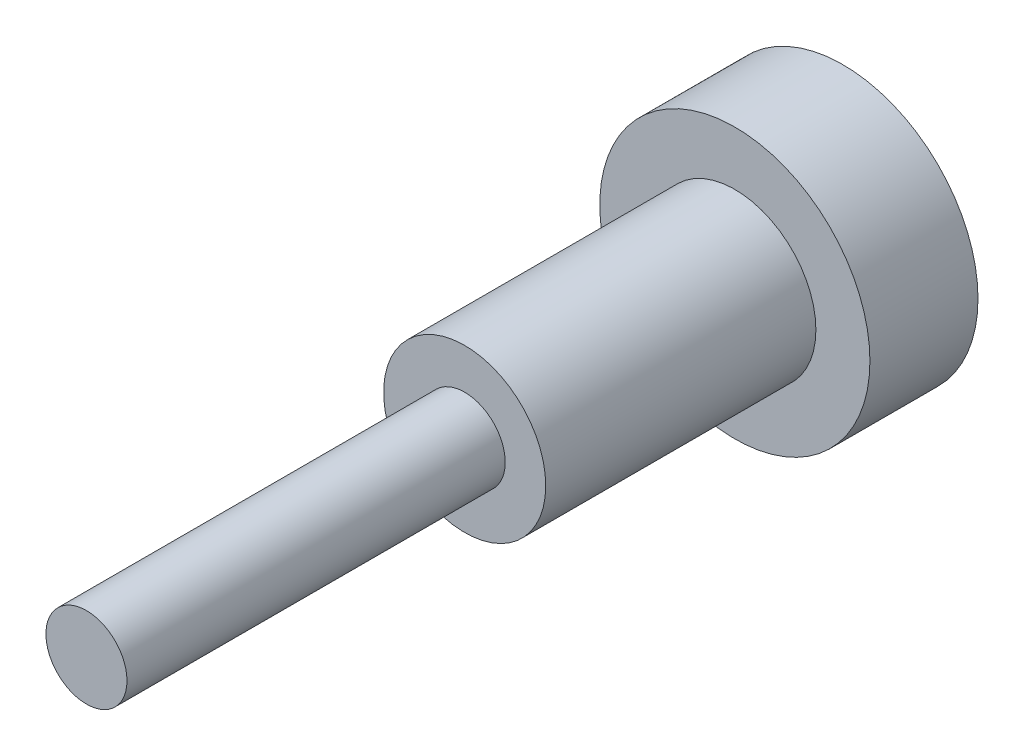
ISO-10303-21;
HEADER;
FILE_DESCRIPTION(('STEP AP214'),'2;1');
FILE_NAME('part.step','',(''),(''),'','','');
FILE_SCHEMA(('AUTOMOTIVE_DESIGN { 1 0 10303 214 1 1 1 1 }'));
ENDSEC;
DATA;
#1=APPLICATION_CONTEXT('core data for automotive mechanical design processes');
#2=APPLICATION_PROTOCOL_DEFINITION('international standard','automotive_design',2000,#1);
#3=PRODUCT_CONTEXT('',#1,'mechanical');
#4=PRODUCT('Part','Part','',(#3));
#5=PRODUCT_RELATED_PRODUCT_CATEGORY('part','',(#4));
#6=PRODUCT_DEFINITION_FORMATION('','',#4);
#7=PRODUCT_DEFINITION_CONTEXT('part definition',#1,'design');
#8=PRODUCT_DEFINITION('design','',#6,#7);
#9=PRODUCT_DEFINITION_SHAPE('','',#8);
#10=(LENGTH_UNIT() NAMED_UNIT(*) SI_UNIT(.MILLI.,.METRE.));
#11=(NAMED_UNIT(*) PLANE_ANGLE_UNIT() SI_UNIT($,.RADIAN.));
#12=(NAMED_UNIT(*) SI_UNIT($,.STERADIAN.) SOLID_ANGLE_UNIT());
#13=UNCERTAINTY_MEASURE_WITH_UNIT(LENGTH_MEASURE(1.E-05),#10,'distance_accuracy_value','');
#14=(GEOMETRIC_REPRESENTATION_CONTEXT(3) GLOBAL_UNCERTAINTY_ASSIGNED_CONTEXT((#13)) GLOBAL_UNIT_ASSIGNED_CONTEXT((#10,
#11,#12)) REPRESENTATION_CONTEXT('',''));
#15=CARTESIAN_POINT('',(0.,0.,0.));
#16=DIRECTION('',(0.,0.,1.));
#17=DIRECTION('',(1.,0.,0.));
#18=AXIS2_PLACEMENT_3D('',#15,#16,#17);
#19=CARTESIAN_POINT('',(0.,0.,12.));
#20=DIRECTION('',(0.,0.,-1.));
#21=DIRECTION('',(-1.,0.,0.));
#22=AXIS2_PLACEMENT_3D('',#19,#20,#21);
#23=CYLINDRICAL_SURFACE('',#22,0.75);
#24=CARTESIAN_POINT('',(0.,0.,5.));
#25=DIRECTION('',(0.,0.,1.));
#26=DIRECTION('',(1.,0.,0.));
#27=AXIS2_PLACEMENT_3D('',#24,#25,#26);
#28=CIRCLE('',#27,0.75);
#29=CARTESIAN_POINT('',(0.75,0.,5.));
#30=VERTEX_POINT('',#29);
#31=EDGE_CURVE('E43',#30,#30,#28,.T.);
#32=ORIENTED_EDGE('',*,*,#31,.T.);
#33=EDGE_LOOP('',(#32));
#34=FACE_BOUND('',#33,.T.);
#35=CARTESIAN_POINT('',(0.,0.,12.));
#36=DIRECTION('',(0.,0.,1.));
#37=DIRECTION('',(1.,0.,0.));
#38=AXIS2_PLACEMENT_3D('',#35,#36,#37);
#39=CIRCLE('',#38,0.75);
#40=CARTESIAN_POINT('',(0.75,0.,12.));
#41=VERTEX_POINT('',#40);
#42=EDGE_CURVE('E10',#41,#41,#39,.T.);
#43=ORIENTED_EDGE('',*,*,#42,.F.);
#44=EDGE_LOOP('',(#43));
#45=FACE_BOUND('',#44,.T.);
#46=ADVANCED_FACE('F33',(#34,#45),#23,.T.);
#47=CARTESIAN_POINT('',(0.,0.,12.));
#48=DIRECTION('',(0.,0.,1.));
#49=DIRECTION('',(1.,0.,0.));
#50=AXIS2_PLACEMENT_3D('',#47,#48,#49);
#51=PLANE('',#50);
#52=ORIENTED_EDGE('',*,*,#42,.T.);
#53=EDGE_LOOP('',(#52));
#54=FACE_BOUND('',#53,.T.);
#55=ADVANCED_FACE('F75',(#54),#51,.T.);
#56=CARTESIAN_POINT('',(0.,0.,5.));
#57=DIRECTION('',(0.,0.,-1.));
#58=DIRECTION('',(-1.,0.,0.));
#59=AXIS2_PLACEMENT_3D('',#56,#57,#58);
#60=CYLINDRICAL_SURFACE('',#59,1.5);
#61=CARTESIAN_POINT('',(0.,0.,5.));
#62=DIRECTION('',(0.,0.,1.));
#63=DIRECTION('',(1.,0.,0.));
#64=AXIS2_PLACEMENT_3D('',#61,#62,#63);
#65=CIRCLE('',#64,1.5);
#66=CARTESIAN_POINT('',(1.5,0.,5.));
#67=VERTEX_POINT('',#66);
#68=EDGE_CURVE('E39',#67,#67,#65,.T.);
#69=ORIENTED_EDGE('',*,*,#68,.F.);
#70=EDGE_LOOP('',(#69));
#71=FACE_BOUND('',#70,.T.);
#72=CARTESIAN_POINT('',(0.,0.,0.));
#73=DIRECTION('',(0.,0.,1.));
#74=DIRECTION('',(1.,0.,0.));
#75=AXIS2_PLACEMENT_3D('',#72,#73,#74);
#76=CIRCLE('',#75,1.5);
#77=CARTESIAN_POINT('',(1.5,0.,0.));
#78=VERTEX_POINT('',#77);
#79=EDGE_CURVE('E47',#78,#78,#76,.T.);
#80=ORIENTED_EDGE('',*,*,#79,.T.);
#81=EDGE_LOOP('',(#80));
#82=FACE_BOUND('',#81,.T.);
#83=ADVANCED_FACE('F80',(#71,#82),#60,.T.);
#84=CARTESIAN_POINT('',(0.,0.,5.));
#85=DIRECTION('',(0.,0.,1.));
#86=DIRECTION('',(1.,0.,0.));
#87=AXIS2_PLACEMENT_3D('',#84,#85,#86);
#88=PLANE('',#87);
#89=ORIENTED_EDGE('',*,*,#31,.F.);
#90=EDGE_LOOP('',(#89));
#91=FACE_BOUND('',#90,.T.);
#92=ORIENTED_EDGE('',*,*,#68,.T.);
#93=EDGE_LOOP('',(#92));
#94=FACE_BOUND('',#93,.T.);
#95=ADVANCED_FACE('F72',(#91,#94),#88,.T.);
#96=CARTESIAN_POINT('',(0.,0.,-2.));
#97=DIRECTION('',(0.,0.,1.));
#98=DIRECTION('',(1.,0.,0.));
#99=AXIS2_PLACEMENT_3D('',#96,#97,#98);
#100=CYLINDRICAL_SURFACE('',#99,2.5);
#101=CARTESIAN_POINT('',(0.,0.,-2.));
#102=DIRECTION('',(0.,0.,1.));
#103=DIRECTION('',(1.,0.,0.));
#104=AXIS2_PLACEMENT_3D('',#101,#102,#103);
#105=CIRCLE('',#104,2.5);
#106=CARTESIAN_POINT('',(2.5,0.,-2.));
#107=VERTEX_POINT('',#106);
#108=EDGE_CURVE('E52',#107,#107,#105,.T.);
#109=ORIENTED_EDGE('',*,*,#108,.T.);
#110=EDGE_LOOP('',(#109));
#111=FACE_BOUND('',#110,.T.);
#112=CARTESIAN_POINT('',(0.,0.,0.));
#113=DIRECTION('',(0.,0.,1.));
#114=DIRECTION('',(1.,0.,0.));
#115=AXIS2_PLACEMENT_3D('',#112,#113,#114);
#116=CIRCLE('',#115,2.5);
#117=CARTESIAN_POINT('',(2.5,0.,0.));
#118=VERTEX_POINT('',#117);
#119=EDGE_CURVE('E53',#118,#118,#116,.T.);
#120=ORIENTED_EDGE('',*,*,#119,.F.);
#121=EDGE_LOOP('',(#120));
#122=FACE_BOUND('',#121,.T.);
#123=ADVANCED_FACE('F59',(#111,#122),#100,.T.);
#124=CARTESIAN_POINT('',(0.,0.,-2.));
#125=DIRECTION('',(0.,0.,1.));
#126=DIRECTION('',(1.,0.,0.));
#127=AXIS2_PLACEMENT_3D('',#124,#125,#126);
#128=PLANE('',#127);
#129=ORIENTED_EDGE('',*,*,#108,.F.);
#130=EDGE_LOOP('',(#129));
#131=FACE_BOUND('',#130,.T.);
#132=ADVANCED_FACE('F62',(#131),#128,.F.);
#133=CARTESIAN_POINT('',(0.,0.,0.));
#134=DIRECTION('',(0.,0.,1.));
#135=DIRECTION('',(1.,0.,0.));
#136=AXIS2_PLACEMENT_3D('',#133,#134,#135);
#137=PLANE('',#136);
#138=ORIENTED_EDGE('',*,*,#79,.F.);
#139=EDGE_LOOP('',(#138));
#140=FACE_BOUND('',#139,.T.);
#141=ORIENTED_EDGE('',*,*,#119,.T.);
#142=EDGE_LOOP('',(#141));
#143=FACE_BOUND('',#142,.T.);
#144=ADVANCED_FACE('F64',(#140,#143),#137,.T.);
#145=CLOSED_SHELL('',(#46,#55,#83,#95,#123,#132,#144));
#146=MANIFOLD_SOLID_BREP('B2',#145);
#147=ADVANCED_BREP_SHAPE_REPRESENTATION('',(#18,#146),#14);
#148=SHAPE_DEFINITION_REPRESENTATION(#9,#147);
ENDSEC;
END-ISO-10303-21;
